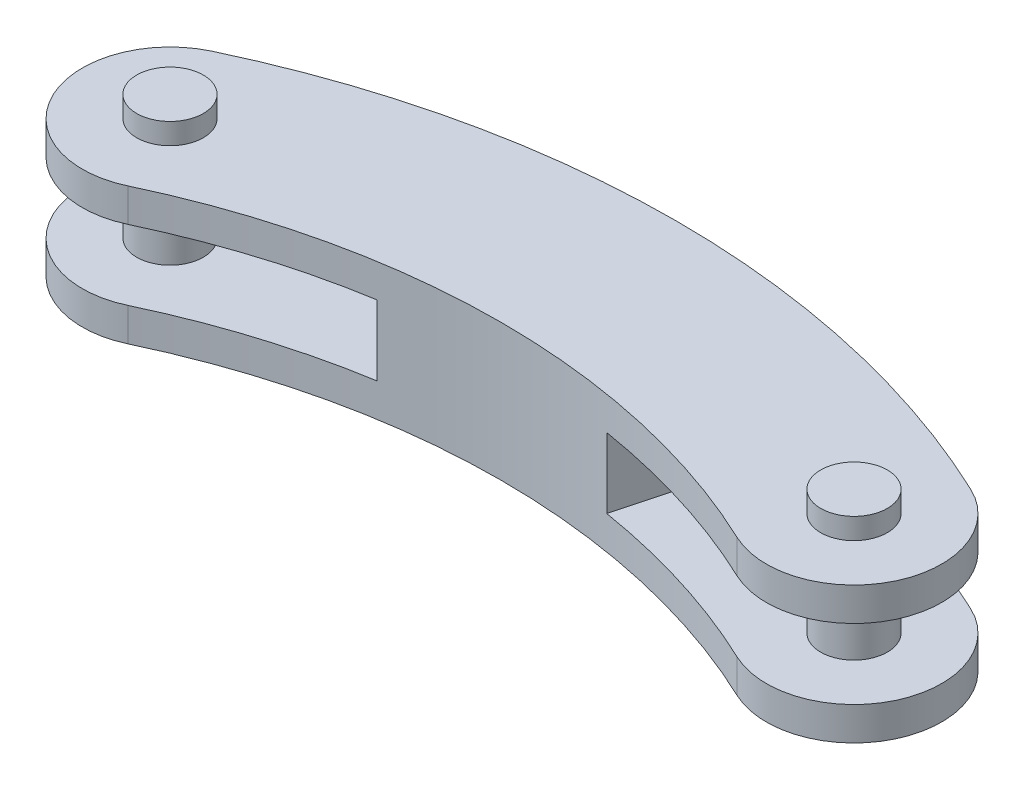
ISO-10303-21;
HEADER;
FILE_DESCRIPTION(('STEP AP214'),'2;1');
FILE_NAME('part.step','',(''),(''),'','','');
FILE_SCHEMA(('AUTOMOTIVE_DESIGN { 1 0 10303 214 1 1 1 1 }'));
ENDSEC;
DATA;
#1=APPLICATION_CONTEXT('core data for automotive mechanical design processes');
#2=APPLICATION_PROTOCOL_DEFINITION('international standard','automotive_design',2000,#1);
#3=PRODUCT_CONTEXT('',#1,'mechanical');
#4=PRODUCT('Part','Part','',(#3));
#5=PRODUCT_RELATED_PRODUCT_CATEGORY('part','',(#4));
#6=PRODUCT_DEFINITION_FORMATION('','',#4);
#7=PRODUCT_DEFINITION_CONTEXT('part definition',#1,'design');
#8=PRODUCT_DEFINITION('design','',#6,#7);
#9=PRODUCT_DEFINITION_SHAPE('','',#8);
#10=(LENGTH_UNIT() NAMED_UNIT(*) SI_UNIT(.MILLI.,.METRE.));
#11=(NAMED_UNIT(*) PLANE_ANGLE_UNIT() SI_UNIT($,.RADIAN.));
#12=(NAMED_UNIT(*) SI_UNIT($,.STERADIAN.) SOLID_ANGLE_UNIT());
#13=UNCERTAINTY_MEASURE_WITH_UNIT(LENGTH_MEASURE(1.E-05),#10,'distance_accuracy_value','');
#14=(GEOMETRIC_REPRESENTATION_CONTEXT(3) GLOBAL_UNCERTAINTY_ASSIGNED_CONTEXT((#13)) GLOBAL_UNIT_ASSIGNED_CONTEXT((#10,
#11,#12)) REPRESENTATION_CONTEXT('',''));
#15=CARTESIAN_POINT('',(0.,0.,0.));
#16=DIRECTION('',(0.,0.,1.));
#17=DIRECTION('',(1.,0.,0.));
#18=AXIS2_PLACEMENT_3D('',#15,#16,#17);
#19=CARTESIAN_POINT('',(97.5,-5.,21.8986899604954));
#20=DIRECTION('',(0.,1.,0.));
#21=DIRECTION('',(0.,0.,1.));
#22=AXIS2_PLACEMENT_3D('',#19,#20,#21);
#23=CYLINDRICAL_SURFACE('',#22,9.49999999999999);
#24=CARTESIAN_POINT('',(97.5,-5.,21.8986899604954));
#25=DIRECTION('',(0.,1.,0.));
#26=DIRECTION('',(0.,0.,1.));
#27=AXIS2_PLACEMENT_3D('',#24,#25,#26);
#28=CIRCLE('',#27,9.49999999999999);
#29=CARTESIAN_POINT('',(97.5,-5.,31.3986899604954));
#30=VERTEX_POINT('',#29);
#31=EDGE_CURVE('E11',#30,#30,#28,.T.);
#32=ORIENTED_EDGE('',*,*,#31,.T.);
#33=EDGE_LOOP('',(#32));
#34=FACE_BOUND('',#33,.T.);
#35=CARTESIAN_POINT('',(97.5,45.,21.8986899604954));
#36=DIRECTION('',(0.,1.,0.));
#37=DIRECTION('',(0.,0.,1.));
#38=AXIS2_PLACEMENT_3D('',#35,#36,#37);
#39=CIRCLE('',#38,9.49999999999999);
#40=CARTESIAN_POINT('',(97.5,45.,31.3986899604954));
#41=VERTEX_POINT('',#40);
#42=EDGE_CURVE('E46',#41,#41,#39,.T.);
#43=ORIENTED_EDGE('',*,*,#42,.F.);
#44=EDGE_LOOP('',(#43));
#45=FACE_BOUND('',#44,.T.);
#46=ADVANCED_FACE('F43',(#34,#45),#23,.T.);
#47=CARTESIAN_POINT('',(97.5,-5.,21.8986899604954));
#48=DIRECTION('',(0.,1.,0.));
#49=DIRECTION('',(0.,0.,1.));
#50=AXIS2_PLACEMENT_3D('',#47,#48,#49);
#51=PLANE('',#50);
#52=ORIENTED_EDGE('',*,*,#31,.F.);
#53=EDGE_LOOP('',(#52));
#54=FACE_BOUND('',#53,.T.);
#55=ADVANCED_FACE('F58',(#54),#51,.F.);
#56=CARTESIAN_POINT('',(97.5,45.,21.8986899604954));
#57=DIRECTION('',(0.,1.,0.));
#58=DIRECTION('',(0.,0.,1.));
#59=AXIS2_PLACEMENT_3D('',#56,#57,#58);
#60=PLANE('',#59);
#61=ORIENTED_EDGE('',*,*,#42,.T.);
#62=EDGE_LOOP('',(#61));
#63=FACE_BOUND('',#62,.T.);
#64=ADVANCED_FACE('F55',(#63),#60,.T.);
#65=CLOSED_SHELL('',(#46,#55,#64));
#66=MANIFOLD_SOLID_BREP('B2',#65);
#67=CARTESIAN_POINT('',(-97.5,-5.,21.8986899604954));
#68=DIRECTION('',(0.,1.,0.));
#69=DIRECTION('',(0.,0.,1.));
#70=AXIS2_PLACEMENT_3D('',#67,#68,#69);
#71=CYLINDRICAL_SURFACE('',#70,9.49999999999999);
#72=CARTESIAN_POINT('',(-97.5,-5.,21.8986899604954));
#73=DIRECTION('',(0.,1.,0.));
#74=DIRECTION('',(0.,0.,1.));
#75=AXIS2_PLACEMENT_3D('',#72,#73,#74);
#76=CIRCLE('',#75,9.49999999999999);
#77=CARTESIAN_POINT('',(-97.5,-5.,31.3986899604954));
#78=VERTEX_POINT('',#77);
#79=EDGE_CURVE('E42',#78,#78,#76,.T.);
#80=ORIENTED_EDGE('',*,*,#79,.T.);
#81=EDGE_LOOP('',(#80));
#82=FACE_BOUND('',#81,.T.);
#83=CARTESIAN_POINT('',(-97.5,45.,21.8986899604954));
#84=DIRECTION('',(0.,1.,0.));
#85=DIRECTION('',(0.,0.,1.));
#86=AXIS2_PLACEMENT_3D('',#83,#84,#85);
#87=CIRCLE('',#86,9.49999999999999);
#88=CARTESIAN_POINT('',(-97.5,45.,31.3986899604954));
#89=VERTEX_POINT('',#88);
#90=EDGE_CURVE('E95',#89,#89,#87,.T.);
#91=ORIENTED_EDGE('',*,*,#90,.F.);
#92=EDGE_LOOP('',(#91));
#93=FACE_BOUND('',#92,.T.);
#94=ADVANCED_FACE('F92',(#82,#93),#71,.T.);
#95=CARTESIAN_POINT('',(-97.5,-5.,21.8986899604954));
#96=DIRECTION('',(0.,1.,0.));
#97=DIRECTION('',(0.,0.,1.));
#98=AXIS2_PLACEMENT_3D('',#95,#96,#97);
#99=PLANE('',#98);
#100=ORIENTED_EDGE('',*,*,#79,.F.);
#101=EDGE_LOOP('',(#100));
#102=FACE_BOUND('',#101,.T.);
#103=ADVANCED_FACE('F107',(#102),#99,.F.);
#104=CARTESIAN_POINT('',(-97.5,45.,21.8986899604954));
#105=DIRECTION('',(0.,1.,0.));
#106=DIRECTION('',(0.,0.,1.));
#107=AXIS2_PLACEMENT_3D('',#104,#105,#106);
#108=PLANE('',#107);
#109=ORIENTED_EDGE('',*,*,#90,.T.);
#110=EDGE_LOOP('',(#109));
#111=FACE_BOUND('',#110,.T.);
#112=ADVANCED_FACE('F104',(#111),#108,.T.);
#113=CLOSED_SHELL('',(#94,#103,#112));
#114=MANIFOLD_SOLID_BREP('B6',#113);
#115=CARTESIAN_POINT('',(48.75,9.5,124.949344980248));
#116=DIRECTION('',(0.,1.,0.));
#117=DIRECTION('',(0.,0.,1.));
#118=AXIS2_PLACEMENT_3D('',#115,#116,#117);
#119=PLANE('',#118);
#120=CARTESIAN_POINT('',(-97.5,9.5,21.8986899604954));
#121=DIRECTION('',(0.,1.,0.));
#122=DIRECTION('',(0.,0.,1.));
#123=AXIS2_PLACEMENT_3D('',#120,#121,#122);
#124=CIRCLE('',#123,9.49999999999999);
#125=CARTESIAN_POINT('',(-97.5,9.5,31.3986899604954));
#126=VERTEX_POINT('',#125);
#127=EDGE_CURVE('E326',#126,#126,#124,.T.);
#128=ORIENTED_EDGE('',*,*,#127,.F.);
#129=EDGE_LOOP('',(#128));
#130=FACE_BOUND('',#129,.T.);
#131=CARTESIAN_POINT('',(0.,9.5,228.));
#132=DIRECTION('',(0.,1.,0.));
#133=DIRECTION('',(0.,0.,1.));
#134=AXIS2_PLACEMENT_3D('',#131,#132,#133);
#135=CIRCLE('',#134,203.);
#136=CARTESIAN_POINT('',(-32.7798129877653,9.5,27.6640724670506));
#137=VERTEX_POINT('',#136);
#138=CARTESIAN_POINT('',(-86.8092105263158,9.5,44.4975178157042));
#139=VERTEX_POINT('',#138);
#140=EDGE_CURVE('E287',#137,#139,#135,.T.);
#141=ORIENTED_EDGE('',*,*,#140,.F.);
#142=DIRECTION('',(-0.258819045102515,0.,-0.96592582628907));
#143=VECTOR('',#142,1.);
#144=CARTESIAN_POINT('',(-37.4999999999991,9.5,10.0480947161666));
#145=LINE('',#144,#143);
#146=CARTESIAN_POINT('',(-45.7724232957001,9.5,-20.8250093251064));
#147=VERTEX_POINT('',#146);
#148=EDGE_CURVE('E257',#137,#147,#145,.T.);
#149=ORIENTED_EDGE('',*,*,#148,.T.);
#150=CARTESIAN_POINT('',(0.,9.5,228.));
#151=DIRECTION('',(0.,1.,0.));
#152=DIRECTION('',(0.,0.,1.));
#153=AXIS2_PLACEMENT_3D('',#150,#151,#152);
#154=CIRCLE('',#153,253.);
#155=CARTESIAN_POINT('',(-108.190789473684,9.5,-0.700137894713487));
#156=VERTEX_POINT('',#155);
#157=EDGE_CURVE('E281',#147,#156,#154,.T.);
#158=ORIENTED_EDGE('',*,*,#157,.T.);
#159=CARTESIAN_POINT('',(-97.5,9.5,21.8986899604954));
#160=DIRECTION('',(0.,1.,0.));
#161=DIRECTION('',(0.,0.,1.));
#162=AXIS2_PLACEMENT_3D('',#159,#160,#161);
#163=CIRCLE('',#162,25.);
#164=EDGE_CURVE('E284',#156,#139,#163,.T.);
#165=ORIENTED_EDGE('',*,*,#164,.T.);
#166=EDGE_LOOP('',(#141,#149,#158,#165));
#167=FACE_BOUND('',#166,.T.);
#168=ADVANCED_FACE('F132',(#130,#167),#119,.T.);
#169=CARTESIAN_POINT('',(97.5,9.5,21.8986899604954));
#170=DIRECTION('',(0.,-1.,0.));
#171=DIRECTION('',(0.,0.,-1.));
#172=AXIS2_PLACEMENT_3D('',#169,#170,#171);
#173=CYLINDRICAL_SURFACE('',#172,25.);
#174=CARTESIAN_POINT('',(97.5,0.,21.8986899604954));
#175=DIRECTION('',(0.,1.,0.));
#176=DIRECTION('',(0.,0.,1.));
#177=AXIS2_PLACEMENT_3D('',#174,#175,#176);
#178=CIRCLE('',#177,25.);
#179=CARTESIAN_POINT('',(86.8092105263158,0.,44.4975178157042));
#180=VERTEX_POINT('',#179);
#181=CARTESIAN_POINT('',(108.190789473684,0.,-0.700137894713404));
#182=VERTEX_POINT('',#181);
#183=EDGE_CURVE('E278',#180,#182,#178,.T.);
#184=ORIENTED_EDGE('',*,*,#183,.T.);
#185=DIRECTION('',(0.,-1.,0.));
#186=VECTOR('',#185,1.);
#187=CARTESIAN_POINT('',(108.190789473684,9.5,-0.700137894713404));
#188=LINE('',#187,#186);
#189=CARTESIAN_POINT('',(108.190789473684,9.5,-0.700137894713404));
#190=VERTEX_POINT('',#189);
#191=EDGE_CURVE('E90',#190,#182,#188,.T.);
#192=ORIENTED_EDGE('',*,*,#191,.F.);
#193=CARTESIAN_POINT('',(97.5,9.5,21.8986899604954));
#194=DIRECTION('',(0.,1.,0.));
#195=DIRECTION('',(0.,0.,1.));
#196=AXIS2_PLACEMENT_3D('',#193,#194,#195);
#197=CIRCLE('',#196,25.);
#198=CARTESIAN_POINT('',(86.8092105263158,9.5,44.4975178157042));
#199=VERTEX_POINT('',#198);
#200=EDGE_CURVE('E279',#199,#190,#197,.T.);
#201=ORIENTED_EDGE('',*,*,#200,.F.);
#202=DIRECTION('',(0.,-1.,0.));
#203=VECTOR('',#202,1.);
#204=CARTESIAN_POINT('',(86.8092105263158,9.5,44.4975178157042));
#205=LINE('',#204,#203);
#206=EDGE_CURVE('E157',#199,#180,#205,.T.);
#207=ORIENTED_EDGE('',*,*,#206,.T.);
#208=EDGE_LOOP('',(#184,#192,#201,#207));
#209=FACE_BOUND('',#208,.T.);
#210=ADVANCED_FACE('F134',(#209),#173,.T.);
#211=CARTESIAN_POINT('',(0.,9.5,228.));
#212=DIRECTION('',(0.,-1.,0.));
#213=DIRECTION('',(0.,0.,-1.));
#214=AXIS2_PLACEMENT_3D('',#211,#212,#213);
#215=CYLINDRICAL_SURFACE('',#214,253.);
#216=CARTESIAN_POINT('',(0.,0.,228.));
#217=DIRECTION('',(0.,1.,0.));
#218=DIRECTION('',(0.,0.,1.));
#219=AXIS2_PLACEMENT_3D('',#216,#217,#218);
#220=CIRCLE('',#219,253.);
#221=CARTESIAN_POINT('',(-108.190789473684,0.,-0.700137894713487));
#222=VERTEX_POINT('',#221);
#223=EDGE_CURVE('E291',#182,#222,#220,.T.);
#224=ORIENTED_EDGE('',*,*,#223,.T.);
#225=DIRECTION('',(0.,-1.,0.));
#226=VECTOR('',#225,1.);
#227=CARTESIAN_POINT('',(-108.190789473684,9.5,-0.700137894713487));
#228=LINE('',#227,#226);
#229=EDGE_CURVE('E141',#156,#222,#228,.T.);
#230=ORIENTED_EDGE('',*,*,#229,.F.);
#231=ORIENTED_EDGE('',*,*,#157,.F.);
#232=DIRECTION('',(0.,-1.,0.));
#233=VECTOR('',#232,1.);
#234=CARTESIAN_POINT('',(-45.7724232957001,29.5,-20.8250093251064));
#235=LINE('',#234,#233);
#236=CARTESIAN_POINT('',(-45.7724232957001,29.5,-20.8250093251064));
#237=VERTEX_POINT('',#236);
#238=EDGE_CURVE('E148',#237,#147,#235,.T.);
#239=ORIENTED_EDGE('',*,*,#238,.F.);
#240=CARTESIAN_POINT('',(0.,29.5,228.));
#241=DIRECTION('',(0.,1.,0.));
#242=DIRECTION('',(0.,0.,1.));
#243=AXIS2_PLACEMENT_3D('',#240,#241,#242);
#244=CIRCLE('',#243,253.);
#245=CARTESIAN_POINT('',(-108.190789473684,29.5,-0.700137894713487));
#246=VERTEX_POINT('',#245);
#247=EDGE_CURVE('E316',#237,#246,#244,.T.);
#248=ORIENTED_EDGE('',*,*,#247,.T.);
#249=DIRECTION('',(0.,-1.,0.));
#250=VECTOR('',#249,1.);
#251=CARTESIAN_POINT('',(-108.190789473684,39.,-0.700137894713487));
#252=LINE('',#251,#250);
#253=CARTESIAN_POINT('',(-108.190789473684,39.,-0.700137894713487));
#254=VERTEX_POINT('',#253);
#255=EDGE_CURVE('E239',#254,#246,#252,.T.);
#256=ORIENTED_EDGE('',*,*,#255,.F.);
#257=CARTESIAN_POINT('',(0.,39.,228.));
#258=DIRECTION('',(0.,1.,0.));
#259=DIRECTION('',(0.,0.,1.));
#260=AXIS2_PLACEMENT_3D('',#257,#258,#259);
#261=CIRCLE('',#260,253.);
#262=CARTESIAN_POINT('',(108.190789473684,39.,-0.700137894713404));
#263=VERTEX_POINT('',#262);
#264=EDGE_CURVE('E231',#263,#254,#261,.T.);
#265=ORIENTED_EDGE('',*,*,#264,.F.);
#266=DIRECTION('',(0.,-1.,0.));
#267=VECTOR('',#266,1.);
#268=CARTESIAN_POINT('',(108.190789473684,39.,-0.700137894713404));
#269=LINE('',#268,#267);
#270=CARTESIAN_POINT('',(108.190789473684,29.5,-0.700137894713404));
#271=VERTEX_POINT('',#270);
#272=EDGE_CURVE('E236',#263,#271,#269,.T.);
#273=ORIENTED_EDGE('',*,*,#272,.T.);
#274=CARTESIAN_POINT('',(45.7724232957001,29.5,-20.8250093251064));
#275=VERTEX_POINT('',#274);
#276=EDGE_CURVE('E324',#271,#275,#244,.T.);
#277=ORIENTED_EDGE('',*,*,#276,.T.);
#278=DIRECTION('',(0.,-1.,0.));
#279=VECTOR('',#278,1.);
#280=CARTESIAN_POINT('',(45.7724232957001,29.5,-20.8250093251064));
#281=LINE('',#280,#279);
#282=CARTESIAN_POINT('',(45.7724232957001,9.5,-20.8250093251064));
#283=VERTEX_POINT('',#282);
#284=EDGE_CURVE('E269',#275,#283,#281,.T.);
#285=ORIENTED_EDGE('',*,*,#284,.T.);
#286=EDGE_CURVE('E183',#190,#283,#154,.T.);
#287=ORIENTED_EDGE('',*,*,#286,.F.);
#288=ORIENTED_EDGE('',*,*,#191,.T.);
#289=EDGE_LOOP('',(#224,#230,#231,#239,#248,#256,#265,#273,#277,#285,#287,#288));
#290=FACE_BOUND('',#289,.T.);
#291=ADVANCED_FACE('F233',(#290),#215,.T.);
#292=CARTESIAN_POINT('',(-97.5,9.5,21.8986899604954));
#293=DIRECTION('',(0.,-1.,0.));
#294=DIRECTION('',(0.,0.,-1.));
#295=AXIS2_PLACEMENT_3D('',#292,#293,#294);
#296=CYLINDRICAL_SURFACE('',#295,25.);
#297=CARTESIAN_POINT('',(-97.5,0.,21.8986899604954));
#298=DIRECTION('',(0.,1.,0.));
#299=DIRECTION('',(0.,0.,1.));
#300=AXIS2_PLACEMENT_3D('',#297,#298,#299);
#301=CIRCLE('',#300,25.);
#302=CARTESIAN_POINT('',(-86.8092105263158,0.,44.4975178157042));
#303=VERTEX_POINT('',#302);
#304=EDGE_CURVE('E293',#222,#303,#301,.T.);
#305=ORIENTED_EDGE('',*,*,#304,.T.);
#306=DIRECTION('',(0.,-1.,0.));
#307=VECTOR('',#306,1.);
#308=CARTESIAN_POINT('',(-86.8092105263158,9.5,44.4975178157042));
#309=LINE('',#308,#307);
#310=EDGE_CURVE('E299',#139,#303,#309,.T.);
#311=ORIENTED_EDGE('',*,*,#310,.F.);
#312=ORIENTED_EDGE('',*,*,#164,.F.);
#313=ORIENTED_EDGE('',*,*,#229,.T.);
#314=EDGE_LOOP('',(#305,#311,#312,#313));
#315=FACE_BOUND('',#314,.T.);
#316=ADVANCED_FACE('F306',(#315),#296,.T.);
#317=CARTESIAN_POINT('',(0.,9.5,228.));
#318=DIRECTION('',(0.,-1.,0.));
#319=DIRECTION('',(0.,0.,-1.));
#320=AXIS2_PLACEMENT_3D('',#317,#318,#319);
#321=CYLINDRICAL_SURFACE('',#320,203.);
#322=CARTESIAN_POINT('',(0.,0.,228.));
#323=DIRECTION('',(0.,1.,0.));
#324=DIRECTION('',(0.,0.,1.));
#325=AXIS2_PLACEMENT_3D('',#322,#323,#324);
#326=CIRCLE('',#325,203.);
#327=EDGE_CURVE('E282',#180,#303,#326,.T.);
#328=ORIENTED_EDGE('',*,*,#327,.F.);
#329=ORIENTED_EDGE('',*,*,#206,.F.);
#330=CARTESIAN_POINT('',(32.7798129877653,9.5,27.6640724670506));
#331=VERTEX_POINT('',#330);
#332=EDGE_CURVE('E288',#199,#331,#135,.T.);
#333=ORIENTED_EDGE('',*,*,#332,.T.);
#334=DIRECTION('',(0.,-1.,0.));
#335=VECTOR('',#334,1.);
#336=CARTESIAN_POINT('',(32.7798129877653,29.5,27.6640724670506));
#337=LINE('',#336,#335);
#338=CARTESIAN_POINT('',(32.7798129877653,29.5,27.6640724670506));
#339=VERTEX_POINT('',#338);
#340=EDGE_CURVE('E273',#339,#331,#337,.T.);
#341=ORIENTED_EDGE('',*,*,#340,.F.);
#342=CARTESIAN_POINT('',(0.,29.5,228.));
#343=DIRECTION('',(0.,-1.,0.));
#344=DIRECTION('',(0.,0.,1.));
#345=AXIS2_PLACEMENT_3D('',#342,#343,#344);
#346=CIRCLE('',#345,203.);
#347=CARTESIAN_POINT('',(86.8092105263158,29.5,44.4975178157043));
#348=VERTEX_POINT('',#347);
#349=EDGE_CURVE('E331',#339,#348,#346,.T.);
#350=ORIENTED_EDGE('',*,*,#349,.T.);
#351=DIRECTION('',(0.,-1.,0.));
#352=VECTOR('',#351,1.);
#353=CARTESIAN_POINT('',(86.8092105263158,39.,44.4975178157043));
#354=LINE('',#353,#352);
#355=CARTESIAN_POINT('',(86.8092105263158,39.,44.4975178157043));
#356=VERTEX_POINT('',#355);
#357=EDGE_CURVE('E333',#356,#348,#354,.T.);
#358=ORIENTED_EDGE('',*,*,#357,.F.);
#359=CARTESIAN_POINT('',(0.,39.,228.));
#360=DIRECTION('',(0.,-1.,0.));
#361=DIRECTION('',(0.,0.,1.));
#362=AXIS2_PLACEMENT_3D('',#359,#360,#361);
#363=CIRCLE('',#362,203.);
#364=CARTESIAN_POINT('',(-86.8092105263158,39.,44.4975178157043));
#365=VERTEX_POINT('',#364);
#366=EDGE_CURVE('E248',#365,#356,#363,.T.);
#367=ORIENTED_EDGE('',*,*,#366,.F.);
#368=DIRECTION('',(0.,-1.,0.));
#369=VECTOR('',#368,1.);
#370=CARTESIAN_POINT('',(-86.8092105263158,39.,44.4975178157043));
#371=LINE('',#370,#369);
#372=CARTESIAN_POINT('',(-86.8092105263158,29.5,44.4975178157043));
#373=VERTEX_POINT('',#372);
#374=EDGE_CURVE('E261',#365,#373,#371,.T.);
#375=ORIENTED_EDGE('',*,*,#374,.T.);
#376=CARTESIAN_POINT('',(-32.7798129877653,29.5,27.6640724670506));
#377=VERTEX_POINT('',#376);
#378=EDGE_CURVE('E252',#373,#377,#346,.T.);
#379=ORIENTED_EDGE('',*,*,#378,.T.);
#380=DIRECTION('',(0.,-1.,0.));
#381=VECTOR('',#380,1.);
#382=CARTESIAN_POINT('',(-32.7798129877653,29.5,27.6640724670506));
#383=LINE('',#382,#381);
#384=EDGE_CURVE('E275',#377,#137,#383,.T.);
#385=ORIENTED_EDGE('',*,*,#384,.T.);
#386=ORIENTED_EDGE('',*,*,#140,.T.);
#387=ORIENTED_EDGE('',*,*,#310,.T.);
#388=EDGE_LOOP('',(#328,#329,#333,#341,#350,#358,#367,#375,#379,#385,#386,#387));
#389=FACE_BOUND('',#388,.T.);
#390=ADVANCED_FACE('F311',(#389),#321,.F.);
#391=CARTESIAN_POINT('',(97.5,9.5,21.8986899604954));
#392=DIRECTION('',(0.,1.,0.));
#393=DIRECTION('',(0.,0.,1.));
#394=AXIS2_PLACEMENT_3D('',#391,#392,#393);
#395=CIRCLE('',#394,9.49999999999999);
#396=CARTESIAN_POINT('',(97.5,9.5,31.3986899604954));
#397=VERTEX_POINT('',#396);
#398=EDGE_CURVE('E346',#397,#397,#395,.T.);
#399=ORIENTED_EDGE('',*,*,#398,.F.);
#400=EDGE_LOOP('',(#399));
#401=FACE_BOUND('',#400,.T.);
#402=DIRECTION('',(0.258819045102514,0.,-0.96592582628907));
#403=VECTOR('',#402,1.);
#404=CARTESIAN_POINT('',(37.4999999999992,9.5,10.0480947161666));
#405=LINE('',#404,#403);
#406=EDGE_CURVE('E259',#331,#283,#405,.T.);
#407=ORIENTED_EDGE('',*,*,#406,.F.);
#408=ORIENTED_EDGE('',*,*,#332,.F.);
#409=ORIENTED_EDGE('',*,*,#200,.T.);
#410=ORIENTED_EDGE('',*,*,#286,.T.);
#411=EDGE_LOOP('',(#407,#408,#409,#410));
#412=FACE_BOUND('',#411,.T.);
#413=ADVANCED_FACE('F377',(#401,#412),#119,.T.);
#414=CARTESIAN_POINT('',(48.75,0.,124.949344980248));
#415=DIRECTION('',(0.,1.,0.));
#416=DIRECTION('',(0.,0.,1.));
#417=AXIS2_PLACEMENT_3D('',#414,#415,#416);
#418=PLANE('',#417);
#419=CARTESIAN_POINT('',(97.5,0.,21.8986899604954));
#420=DIRECTION('',(0.,1.,0.));
#421=DIRECTION('',(0.,0.,1.));
#422=AXIS2_PLACEMENT_3D('',#419,#420,#421);
#423=CIRCLE('',#422,9.49999999999999);
#424=CARTESIAN_POINT('',(97.5,0.,31.3986899604954));
#425=VERTEX_POINT('',#424);
#426=EDGE_CURVE('E354',#425,#425,#423,.T.);
#427=ORIENTED_EDGE('',*,*,#426,.T.);
#428=EDGE_LOOP('',(#427));
#429=FACE_BOUND('',#428,.T.);
#430=CARTESIAN_POINT('',(-97.5,0.,21.8986899604954));
#431=DIRECTION('',(0.,1.,0.));
#432=DIRECTION('',(0.,0.,1.));
#433=AXIS2_PLACEMENT_3D('',#430,#431,#432);
#434=CIRCLE('',#433,9.49999999999999);
#435=CARTESIAN_POINT('',(-97.5,0.,31.3986899604954));
#436=VERTEX_POINT('',#435);
#437=EDGE_CURVE('E345',#436,#436,#434,.T.);
#438=ORIENTED_EDGE('',*,*,#437,.T.);
#439=EDGE_LOOP('',(#438));
#440=FACE_BOUND('',#439,.T.);
#441=ORIENTED_EDGE('',*,*,#183,.F.);
#442=ORIENTED_EDGE('',*,*,#327,.T.);
#443=ORIENTED_EDGE('',*,*,#304,.F.);
#444=ORIENTED_EDGE('',*,*,#223,.F.);
#445=EDGE_LOOP('',(#441,#442,#443,#444));
#446=FACE_BOUND('',#445,.T.);
#447=ADVANCED_FACE('F310',(#429,#440,#446),#418,.F.);
#448=CARTESIAN_POINT('',(-37.4999999999991,29.5,10.0480947161666));
#449=DIRECTION('',(-0.96592582628907,0.,0.258819045102515));
#450=DIRECTION('',(0.258819045102515,0.,0.96592582628907));
#451=AXIS2_PLACEMENT_3D('',#448,#449,#450);
#452=PLANE('',#451);
#453=ORIENTED_EDGE('',*,*,#148,.F.);
#454=ORIENTED_EDGE('',*,*,#384,.F.);
#455=DIRECTION('',(-0.258819045102515,0.,-0.96592582628907));
#456=VECTOR('',#455,1.);
#457=CARTESIAN_POINT('',(-37.4999999999991,29.5,10.0480947161666));
#458=LINE('',#457,#456);
#459=EDGE_CURVE('E265',#377,#237,#458,.T.);
#460=ORIENTED_EDGE('',*,*,#459,.T.);
#461=ORIENTED_EDGE('',*,*,#238,.T.);
#462=EDGE_LOOP('',(#453,#454,#460,#461));
#463=FACE_BOUND('',#462,.T.);
#464=ADVANCED_FACE('F318',(#463),#452,.T.);
#465=CARTESIAN_POINT('',(37.4999999999992,29.5,10.0480947161666));
#466=DIRECTION('',(-0.96592582628907,0.,-0.258819045102514));
#467=DIRECTION('',(-0.258819045102514,0.,0.96592582628907));
#468=AXIS2_PLACEMENT_3D('',#465,#466,#467);
#469=PLANE('',#468);
#470=ORIENTED_EDGE('',*,*,#406,.T.);
#471=ORIENTED_EDGE('',*,*,#284,.F.);
#472=DIRECTION('',(0.258819045102514,0.,-0.96592582628907));
#473=VECTOR('',#472,1.);
#474=CARTESIAN_POINT('',(37.4999999999992,29.5,10.0480947161666));
#475=LINE('',#474,#473);
#476=EDGE_CURVE('E267',#339,#275,#475,.T.);
#477=ORIENTED_EDGE('',*,*,#476,.F.);
#478=ORIENTED_EDGE('',*,*,#340,.T.);
#479=EDGE_LOOP('',(#470,#471,#477,#478));
#480=FACE_BOUND('',#479,.T.);
#481=ADVANCED_FACE('F398',(#480),#469,.F.);
#482=CARTESIAN_POINT('',(48.75,29.5,124.949344980248));
#483=DIRECTION('',(0.,1.,0.));
#484=DIRECTION('',(0.,0.,1.));
#485=AXIS2_PLACEMENT_3D('',#482,#483,#484);
#486=PLANE('',#485);
#487=CARTESIAN_POINT('',(97.5,29.5,21.8986899604954));
#488=DIRECTION('',(0.,1.,0.));
#489=DIRECTION('',(0.,0.,1.));
#490=AXIS2_PLACEMENT_3D('',#487,#488,#489);
#491=CIRCLE('',#490,9.49999999999999);
#492=CARTESIAN_POINT('',(97.5,29.5,31.3986899604954));
#493=VERTEX_POINT('',#492);
#494=EDGE_CURVE('E351',#493,#493,#491,.T.);
#495=ORIENTED_EDGE('',*,*,#494,.T.);
#496=EDGE_LOOP('',(#495));
#497=FACE_BOUND('',#496,.T.);
#498=ORIENTED_EDGE('',*,*,#349,.F.);
#499=ORIENTED_EDGE('',*,*,#476,.T.);
#500=ORIENTED_EDGE('',*,*,#276,.F.);
#501=CARTESIAN_POINT('',(97.5,29.5,21.8986899604954));
#502=DIRECTION('',(0.,1.,0.));
#503=DIRECTION('',(0.,0.,1.));
#504=AXIS2_PLACEMENT_3D('',#501,#502,#503);
#505=CIRCLE('',#504,25.);
#506=EDGE_CURVE('E256',#348,#271,#505,.T.);
#507=ORIENTED_EDGE('',*,*,#506,.F.);
#508=EDGE_LOOP('',(#498,#499,#500,#507));
#509=FACE_BOUND('',#508,.T.);
#510=ADVANCED_FACE('F400',(#497,#509),#486,.F.);
#511=CARTESIAN_POINT('',(97.5,39.,21.8986899604954));
#512=DIRECTION('',(0.,-1.,0.));
#513=DIRECTION('',(0.,0.,-1.));
#514=AXIS2_PLACEMENT_3D('',#511,#512,#513);
#515=CYLINDRICAL_SURFACE('',#514,25.);
#516=ORIENTED_EDGE('',*,*,#506,.T.);
#517=ORIENTED_EDGE('',*,*,#272,.F.);
#518=CARTESIAN_POINT('',(97.5,39.,21.8986899604954));
#519=DIRECTION('',(0.,1.,0.));
#520=DIRECTION('',(0.,0.,1.));
#521=AXIS2_PLACEMENT_3D('',#518,#519,#520);
#522=CIRCLE('',#521,25.);
#523=EDGE_CURVE('E243',#356,#263,#522,.T.);
#524=ORIENTED_EDGE('',*,*,#523,.F.);
#525=ORIENTED_EDGE('',*,*,#357,.T.);
#526=EDGE_LOOP('',(#516,#517,#524,#525));
#527=FACE_BOUND('',#526,.T.);
#528=ADVANCED_FACE('F254',(#527),#515,.T.);
#529=CARTESIAN_POINT('',(-97.5,39.,21.8986899604954));
#530=DIRECTION('',(0.,-1.,0.));
#531=DIRECTION('',(0.,0.,-1.));
#532=AXIS2_PLACEMENT_3D('',#529,#530,#531);
#533=CYLINDRICAL_SURFACE('',#532,25.);
#534=CARTESIAN_POINT('',(-97.5,29.5,21.8986899604954));
#535=DIRECTION('',(0.,1.,0.));
#536=DIRECTION('',(0.,0.,1.));
#537=AXIS2_PLACEMENT_3D('',#534,#535,#536);
#538=CIRCLE('',#537,25.);
#539=EDGE_CURVE('E323',#246,#373,#538,.T.);
#540=ORIENTED_EDGE('',*,*,#539,.T.);
#541=ORIENTED_EDGE('',*,*,#374,.F.);
#542=CARTESIAN_POINT('',(-97.5,39.,21.8986899604954));
#543=DIRECTION('',(0.,1.,0.));
#544=DIRECTION('',(0.,0.,1.));
#545=AXIS2_PLACEMENT_3D('',#542,#543,#544);
#546=CIRCLE('',#545,25.);
#547=EDGE_CURVE('E242',#254,#365,#546,.T.);
#548=ORIENTED_EDGE('',*,*,#547,.F.);
#549=ORIENTED_EDGE('',*,*,#255,.T.);
#550=EDGE_LOOP('',(#540,#541,#548,#549));
#551=FACE_BOUND('',#550,.T.);
#552=ADVANCED_FACE('F337',(#551),#533,.T.);
#553=CARTESIAN_POINT('',(48.75,39.,124.949344980248));
#554=DIRECTION('',(0.,1.,0.));
#555=DIRECTION('',(0.,0.,1.));
#556=AXIS2_PLACEMENT_3D('',#553,#554,#555);
#557=PLANE('',#556);
#558=CARTESIAN_POINT('',(97.5,39.,21.8986899604954));
#559=DIRECTION('',(0.,1.,0.));
#560=DIRECTION('',(0.,0.,1.));
#561=AXIS2_PLACEMENT_3D('',#558,#559,#560);
#562=CIRCLE('',#561,9.49999999999999);
#563=CARTESIAN_POINT('',(97.5,39.,31.3986899604954));
#564=VERTEX_POINT('',#563);
#565=EDGE_CURVE('E355',#564,#564,#562,.T.);
#566=ORIENTED_EDGE('',*,*,#565,.F.);
#567=EDGE_LOOP('',(#566));
#568=FACE_BOUND('',#567,.T.);
#569=CARTESIAN_POINT('',(-97.5,39.,21.8986899604954));
#570=DIRECTION('',(0.,1.,0.));
#571=DIRECTION('',(0.,0.,1.));
#572=AXIS2_PLACEMENT_3D('',#569,#570,#571);
#573=CIRCLE('',#572,9.49999999999999);
#574=CARTESIAN_POINT('',(-97.5,39.,31.3986899604954));
#575=VERTEX_POINT('',#574);
#576=EDGE_CURVE('E342',#575,#575,#573,.T.);
#577=ORIENTED_EDGE('',*,*,#576,.F.);
#578=EDGE_LOOP('',(#577));
#579=FACE_BOUND('',#578,.T.);
#580=ORIENTED_EDGE('',*,*,#523,.T.);
#581=ORIENTED_EDGE('',*,*,#264,.T.);
#582=ORIENTED_EDGE('',*,*,#547,.T.);
#583=ORIENTED_EDGE('',*,*,#366,.T.);
#584=EDGE_LOOP('',(#580,#581,#582,#583));
#585=FACE_BOUND('',#584,.T.);
#586=ADVANCED_FACE('F246',(#568,#579,#585),#557,.T.);
#587=CARTESIAN_POINT('',(-97.5,29.5,21.8986899604954));
#588=DIRECTION('',(0.,1.,0.));
#589=DIRECTION('',(0.,0.,1.));
#590=AXIS2_PLACEMENT_3D('',#587,#588,#589);
#591=CIRCLE('',#590,9.49999999999999);
#592=CARTESIAN_POINT('',(-97.5,29.5,31.3986899604954));
#593=VERTEX_POINT('',#592);
#594=EDGE_CURVE('E136',#593,#593,#591,.T.);
#595=ORIENTED_EDGE('',*,*,#594,.T.);
#596=EDGE_LOOP('',(#595));
#597=FACE_BOUND('',#596,.T.);
#598=ORIENTED_EDGE('',*,*,#459,.F.);
#599=ORIENTED_EDGE('',*,*,#378,.F.);
#600=ORIENTED_EDGE('',*,*,#539,.F.);
#601=ORIENTED_EDGE('',*,*,#247,.F.);
#602=EDGE_LOOP('',(#598,#599,#600,#601));
#603=FACE_BOUND('',#602,.T.);
#604=ADVANCED_FACE('F322',(#597,#603),#486,.F.);
#605=CARTESIAN_POINT('',(-97.5,0.,21.8986899604954));
#606=DIRECTION('',(0.,1.,0.));
#607=DIRECTION('',(0.,0.,1.));
#608=AXIS2_PLACEMENT_3D('',#605,#606,#607);
#609=CYLINDRICAL_SURFACE('',#608,9.49999999999999);
#610=ORIENTED_EDGE('',*,*,#576,.T.);
#611=EDGE_LOOP('',(#610));
#612=FACE_BOUND('',#611,.T.);
#613=ORIENTED_EDGE('',*,*,#594,.F.);
#614=EDGE_LOOP('',(#613));
#615=FACE_BOUND('',#614,.T.);
#616=ADVANCED_FACE('F413',(#612,#615),#609,.F.);
#617=ORIENTED_EDGE('',*,*,#127,.T.);
#618=EDGE_LOOP('',(#617));
#619=FACE_BOUND('',#618,.T.);
#620=ORIENTED_EDGE('',*,*,#437,.F.);
#621=EDGE_LOOP('',(#620));
#622=FACE_BOUND('',#621,.T.);
#623=ADVANCED_FACE('F371',(#619,#622),#609,.F.);
#624=CARTESIAN_POINT('',(97.5,0.,21.8986899604954));
#625=DIRECTION('',(0.,1.,0.));
#626=DIRECTION('',(0.,0.,1.));
#627=AXIS2_PLACEMENT_3D('',#624,#625,#626);
#628=CYLINDRICAL_SURFACE('',#627,9.49999999999999);
#629=ORIENTED_EDGE('',*,*,#565,.T.);
#630=EDGE_LOOP('',(#629));
#631=FACE_BOUND('',#630,.T.);
#632=ORIENTED_EDGE('',*,*,#494,.F.);
#633=EDGE_LOOP('',(#632));
#634=FACE_BOUND('',#633,.T.);
#635=ADVANCED_FACE('F365',(#631,#634),#628,.F.);
#636=ORIENTED_EDGE('',*,*,#398,.T.);
#637=EDGE_LOOP('',(#636));
#638=FACE_BOUND('',#637,.T.);
#639=ORIENTED_EDGE('',*,*,#426,.F.);
#640=EDGE_LOOP('',(#639));
#641=FACE_BOUND('',#640,.T.);
#642=ADVANCED_FACE('F363',(#638,#641),#628,.F.);
#643=CLOSED_SHELL('',(#168,#210,#291,#316,#390,#413,#447,#464,#481,#510,#528,#552,#586,#604,
#616,#623,#635,#642));
#644=MANIFOLD_SOLID_BREP('B37',#643);
#645=ADVANCED_BREP_SHAPE_REPRESENTATION('',(#18,#66,#114,#644),#14);
#646=SHAPE_DEFINITION_REPRESENTATION(#9,#645);
ENDSEC;
END-ISO-10303-21;
